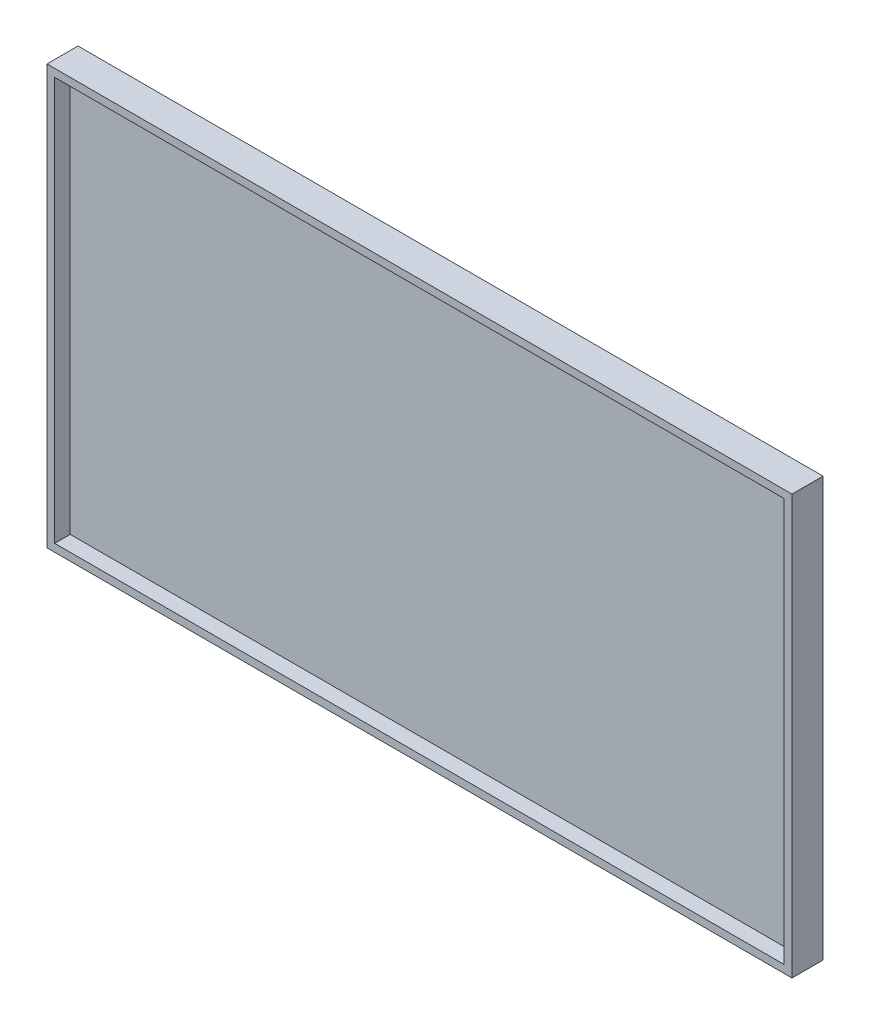
ISO-10303-21;
HEADER;
FILE_DESCRIPTION(('STEP AP214'),'2;1');
FILE_NAME('part.step','',(''),(''),'','','');
FILE_SCHEMA(('AUTOMOTIVE_DESIGN { 1 0 10303 214 1 1 1 1 }'));
ENDSEC;
DATA;
#1=APPLICATION_CONTEXT('core data for automotive mechanical design processes');
#2=APPLICATION_PROTOCOL_DEFINITION('international standard','automotive_design',2000,#1);
#3=PRODUCT_CONTEXT('',#1,'mechanical');
#4=PRODUCT('Part','Part','',(#3));
#5=PRODUCT_RELATED_PRODUCT_CATEGORY('part','',(#4));
#6=PRODUCT_DEFINITION_FORMATION('','',#4);
#7=PRODUCT_DEFINITION_CONTEXT('part definition',#1,'design');
#8=PRODUCT_DEFINITION('design','',#6,#7);
#9=PRODUCT_DEFINITION_SHAPE('','',#8);
#10=(LENGTH_UNIT() NAMED_UNIT(*) SI_UNIT(.MILLI.,.METRE.));
#11=(NAMED_UNIT(*) PLANE_ANGLE_UNIT() SI_UNIT($,.RADIAN.));
#12=(NAMED_UNIT(*) SI_UNIT($,.STERADIAN.) SOLID_ANGLE_UNIT());
#13=UNCERTAINTY_MEASURE_WITH_UNIT(LENGTH_MEASURE(1.E-05),#10,'distance_accuracy_value','');
#14=(GEOMETRIC_REPRESENTATION_CONTEXT(3) GLOBAL_UNCERTAINTY_ASSIGNED_CONTEXT((#13)) GLOBAL_UNIT_ASSIGNED_CONTEXT((#10,
#11,#12)) REPRESENTATION_CONTEXT('',''));
#15=CARTESIAN_POINT('',(0.,0.,0.));
#16=DIRECTION('',(0.,0.,1.));
#17=DIRECTION('',(1.,0.,0.));
#18=AXIS2_PLACEMENT_3D('',#15,#16,#17);
#19=CARTESIAN_POINT('',(42.75,61.5,-56.));
#20=DIRECTION('',(-1.,0.,0.));
#21=DIRECTION('',(0.,-1.,0.));
#22=AXIS2_PLACEMENT_3D('',#19,#20,#21);
#23=PLANE('',#22);
#24=DIRECTION('',(0.,1.,0.));
#25=VECTOR('',#24,1.);
#26=CARTESIAN_POINT('',(42.75,61.5,-58.));
#27=LINE('',#26,#25);
#28=CARTESIAN_POINT('',(42.75,34.5,-58.));
#29=VERTEX_POINT('',#28);
#30=CARTESIAN_POINT('',(42.75,61.5,-58.));
#31=VERTEX_POINT('',#30);
#32=EDGE_CURVE('E146',#29,#31,#27,.T.);
#33=ORIENTED_EDGE('',*,*,#32,.T.);
#34=DIRECTION('',(0.,0.,-1.));
#35=VECTOR('',#34,1.);
#36=CARTESIAN_POINT('',(42.75,61.5,-56.));
#37=LINE('',#36,#35);
#38=CARTESIAN_POINT('',(42.75,61.5,-56.));
#39=VERTEX_POINT('',#38);
#40=EDGE_CURVE('E11',#39,#31,#37,.T.);
#41=ORIENTED_EDGE('',*,*,#40,.F.);
#42=DIRECTION('',(0.,1.,0.));
#43=VECTOR('',#42,1.);
#44=CARTESIAN_POINT('',(42.75,61.5,-56.));
#45=LINE('',#44,#43);
#46=CARTESIAN_POINT('',(42.75,34.5,-56.));
#47=VERTEX_POINT('',#46);
#48=EDGE_CURVE('E150',#47,#39,#45,.T.);
#49=ORIENTED_EDGE('',*,*,#48,.F.);
#50=DIRECTION('',(0.,0.,-1.));
#51=VECTOR('',#50,1.);
#52=CARTESIAN_POINT('',(42.75,34.5,-56.));
#53=LINE('',#52,#51);
#54=EDGE_CURVE('E156',#47,#29,#53,.T.);
#55=ORIENTED_EDGE('',*,*,#54,.T.);
#56=EDGE_LOOP('',(#33,#41,#49,#55));
#57=FACE_BOUND('',#56,.T.);
#58=ADVANCED_FACE('F38',(#57),#23,.F.);
#59=CARTESIAN_POINT('',(42.75,61.5,-56.));
#60=DIRECTION('',(0.,-1.,0.));
#61=DIRECTION('',(1.,0.,0.));
#62=AXIS2_PLACEMENT_3D('',#59,#60,#61);
#63=PLANE('',#62);
#64=DIRECTION('',(-1.,0.,0.));
#65=VECTOR('',#64,1.);
#66=CARTESIAN_POINT('',(42.75,61.5,-58.));
#67=LINE('',#66,#65);
#68=CARTESIAN_POINT('',(-5.24999999999999,61.5,-58.));
#69=VERTEX_POINT('',#68);
#70=EDGE_CURVE('E159',#31,#69,#67,.T.);
#71=ORIENTED_EDGE('',*,*,#70,.T.);
#72=DIRECTION('',(0.,0.,-1.));
#73=VECTOR('',#72,1.);
#74=CARTESIAN_POINT('',(-5.24999999999999,61.5,-56.));
#75=LINE('',#74,#73);
#76=CARTESIAN_POINT('',(-5.24999999999999,61.5,-56.));
#77=VERTEX_POINT('',#76);
#78=EDGE_CURVE('E45',#77,#69,#75,.T.);
#79=ORIENTED_EDGE('',*,*,#78,.F.);
#80=DIRECTION('',(-1.,0.,0.));
#81=VECTOR('',#80,1.);
#82=CARTESIAN_POINT('',(42.75,61.5,-56.));
#83=LINE('',#82,#81);
#84=EDGE_CURVE('E89',#39,#77,#83,.T.);
#85=ORIENTED_EDGE('',*,*,#84,.F.);
#86=ORIENTED_EDGE('',*,*,#40,.T.);
#87=EDGE_LOOP('',(#71,#79,#85,#86));
#88=FACE_BOUND('',#87,.T.);
#89=ADVANCED_FACE('F188',(#88),#63,.F.);
#90=CARTESIAN_POINT('',(-5.24999999999999,61.5,-56.));
#91=DIRECTION('',(1.,0.,0.));
#92=DIRECTION('',(0.,1.,0.));
#93=AXIS2_PLACEMENT_3D('',#90,#91,#92);
#94=PLANE('',#93);
#95=DIRECTION('',(0.,-1.,0.));
#96=VECTOR('',#95,1.);
#97=CARTESIAN_POINT('',(-5.24999999999999,61.5,-58.));
#98=LINE('',#97,#96);
#99=CARTESIAN_POINT('',(-5.24999999999999,34.5,-58.));
#100=VERTEX_POINT('',#99);
#101=EDGE_CURVE('E161',#69,#100,#98,.T.);
#102=ORIENTED_EDGE('',*,*,#101,.T.);
#103=DIRECTION('',(0.,0.,-1.));
#104=VECTOR('',#103,1.);
#105=CARTESIAN_POINT('',(-5.24999999999999,34.5,-56.));
#106=LINE('',#105,#104);
#107=CARTESIAN_POINT('',(-5.24999999999999,34.5,-56.));
#108=VERTEX_POINT('',#107);
#109=EDGE_CURVE('E165',#108,#100,#106,.T.);
#110=ORIENTED_EDGE('',*,*,#109,.F.);
#111=DIRECTION('',(0.,-1.,0.));
#112=VECTOR('',#111,1.);
#113=CARTESIAN_POINT('',(-5.24999999999999,61.5,-56.));
#114=LINE('',#113,#112);
#115=EDGE_CURVE('E153',#77,#108,#114,.T.);
#116=ORIENTED_EDGE('',*,*,#115,.F.);
#117=ORIENTED_EDGE('',*,*,#78,.T.);
#118=EDGE_LOOP('',(#102,#110,#116,#117));
#119=FACE_BOUND('',#118,.T.);
#120=ADVANCED_FACE('F170',(#119),#94,.F.);
#121=CARTESIAN_POINT('',(42.75,34.5,-56.));
#122=DIRECTION('',(0.,1.,0.));
#123=DIRECTION('',(-1.,0.,0.));
#124=AXIS2_PLACEMENT_3D('',#121,#122,#123);
#125=PLANE('',#124);
#126=DIRECTION('',(1.,0.,0.));
#127=VECTOR('',#126,1.);
#128=CARTESIAN_POINT('',(42.75,34.5,-58.));
#129=LINE('',#128,#127);
#130=EDGE_CURVE('E82',#100,#29,#129,.T.);
#131=ORIENTED_EDGE('',*,*,#130,.T.);
#132=ORIENTED_EDGE('',*,*,#54,.F.);
#133=DIRECTION('',(1.,0.,0.));
#134=VECTOR('',#133,1.);
#135=CARTESIAN_POINT('',(42.75,34.5,-56.));
#136=LINE('',#135,#134);
#137=EDGE_CURVE('E61',#108,#47,#136,.T.);
#138=ORIENTED_EDGE('',*,*,#137,.F.);
#139=ORIENTED_EDGE('',*,*,#109,.T.);
#140=EDGE_LOOP('',(#131,#132,#138,#139));
#141=FACE_BOUND('',#140,.T.);
#142=ADVANCED_FACE('F178',(#141),#125,.F.);
#143=CARTESIAN_POINT('',(0.,0.,-56.));
#144=DIRECTION('',(0.,0.,-1.));
#145=DIRECTION('',(-1.,0.,0.));
#146=AXIS2_PLACEMENT_3D('',#143,#144,#145);
#147=PLANE('',#146);
#148=DIRECTION('',(-1.,0.,0.));
#149=VECTOR('',#148,1.);
#150=CARTESIAN_POINT('',(0.,61.,-56.));
#151=LINE('',#150,#149);
#152=CARTESIAN_POINT('',(42.25,61.,-56.));
#153=VERTEX_POINT('',#152);
#154=CARTESIAN_POINT('',(-4.74999999999999,61.,-56.));
#155=VERTEX_POINT('',#154);
#156=EDGE_CURVE('E140',#153,#155,#151,.T.);
#157=ORIENTED_EDGE('',*,*,#156,.F.);
#158=DIRECTION('',(0.,1.,0.));
#159=VECTOR('',#158,1.);
#160=CARTESIAN_POINT('',(42.25,0.,-56.));
#161=LINE('',#160,#159);
#162=CARTESIAN_POINT('',(42.25,35.,-56.));
#163=VERTEX_POINT('',#162);
#164=EDGE_CURVE('E52',#163,#153,#161,.T.);
#165=ORIENTED_EDGE('',*,*,#164,.F.);
#166=DIRECTION('',(1.,0.,0.));
#167=VECTOR('',#166,1.);
#168=CARTESIAN_POINT('',(0.,35.,-56.));
#169=LINE('',#168,#167);
#170=CARTESIAN_POINT('',(-4.74999999999999,35.,-56.));
#171=VERTEX_POINT('',#170);
#172=EDGE_CURVE('E131',#171,#163,#169,.T.);
#173=ORIENTED_EDGE('',*,*,#172,.F.);
#174=DIRECTION('',(0.,-1.,0.));
#175=VECTOR('',#174,1.);
#176=CARTESIAN_POINT('',(-4.74999999999999,0.,-56.));
#177=LINE('',#176,#175);
#178=EDGE_CURVE('E134',#155,#171,#177,.T.);
#179=ORIENTED_EDGE('',*,*,#178,.F.);
#180=EDGE_LOOP('',(#157,#165,#173,#179));
#181=FACE_BOUND('',#180,.T.);
#182=ORIENTED_EDGE('',*,*,#48,.T.);
#183=ORIENTED_EDGE('',*,*,#84,.T.);
#184=ORIENTED_EDGE('',*,*,#115,.T.);
#185=ORIENTED_EDGE('',*,*,#137,.T.);
#186=EDGE_LOOP('',(#182,#183,#184,#185));
#187=FACE_BOUND('',#186,.T.);
#188=ADVANCED_FACE('F180',(#181,#187),#147,.F.);
#189=CARTESIAN_POINT('',(0.,0.,-58.));
#190=DIRECTION('',(0.,0.,-1.));
#191=DIRECTION('',(-1.,0.,0.));
#192=AXIS2_PLACEMENT_3D('',#189,#190,#191);
#193=PLANE('',#192);
#194=ORIENTED_EDGE('',*,*,#32,.F.);
#195=ORIENTED_EDGE('',*,*,#130,.F.);
#196=ORIENTED_EDGE('',*,*,#101,.F.);
#197=ORIENTED_EDGE('',*,*,#70,.F.);
#198=EDGE_LOOP('',(#194,#195,#196,#197));
#199=FACE_BOUND('',#198,.T.);
#200=ADVANCED_FACE('F174',(#199),#193,.T.);
#201=CARTESIAN_POINT('',(42.25,0.,-57.));
#202=DIRECTION('',(1.,0.,0.));
#203=DIRECTION('',(0.,0.,-1.));
#204=AXIS2_PLACEMENT_3D('',#201,#202,#203);
#205=PLANE('',#204);
#206=ORIENTED_EDGE('',*,*,#164,.T.);
#207=DIRECTION('',(0.,0.,1.));
#208=VECTOR('',#207,1.);
#209=CARTESIAN_POINT('',(42.25,61.,-57.));
#210=LINE('',#209,#208);
#211=CARTESIAN_POINT('',(42.25,61.,-57.));
#212=VERTEX_POINT('',#211);
#213=EDGE_CURVE('E109',#212,#153,#210,.T.);
#214=ORIENTED_EDGE('',*,*,#213,.F.);
#215=DIRECTION('',(0.,1.,0.));
#216=VECTOR('',#215,1.);
#217=CARTESIAN_POINT('',(42.25,0.,-57.));
#218=LINE('',#217,#216);
#219=CARTESIAN_POINT('',(42.25,35.,-57.));
#220=VERTEX_POINT('',#219);
#221=EDGE_CURVE('E113',#220,#212,#218,.T.);
#222=ORIENTED_EDGE('',*,*,#221,.F.);
#223=DIRECTION('',(0.,0.,1.));
#224=VECTOR('',#223,1.);
#225=CARTESIAN_POINT('',(42.25,35.,-57.));
#226=LINE('',#225,#224);
#227=EDGE_CURVE('E144',#220,#163,#226,.T.);
#228=ORIENTED_EDGE('',*,*,#227,.T.);
#229=EDGE_LOOP('',(#206,#214,#222,#228));
#230=FACE_BOUND('',#229,.T.);
#231=ADVANCED_FACE('F111',(#230),#205,.F.);
#232=CARTESIAN_POINT('',(0.,35.,-57.));
#233=DIRECTION('',(0.,-1.,0.));
#234=DIRECTION('',(0.,0.,-1.));
#235=AXIS2_PLACEMENT_3D('',#232,#233,#234);
#236=PLANE('',#235);
#237=ORIENTED_EDGE('',*,*,#172,.T.);
#238=ORIENTED_EDGE('',*,*,#227,.F.);
#239=DIRECTION('',(1.,0.,0.));
#240=VECTOR('',#239,1.);
#241=CARTESIAN_POINT('',(0.,35.,-57.));
#242=LINE('',#241,#240);
#243=CARTESIAN_POINT('',(-4.74999999999999,35.,-57.));
#244=VERTEX_POINT('',#243);
#245=EDGE_CURVE('E119',#244,#220,#242,.T.);
#246=ORIENTED_EDGE('',*,*,#245,.F.);
#247=DIRECTION('',(0.,0.,1.));
#248=VECTOR('',#247,1.);
#249=CARTESIAN_POINT('',(-4.74999999999999,35.,-57.));
#250=LINE('',#249,#248);
#251=EDGE_CURVE('E147',#244,#171,#250,.T.);
#252=ORIENTED_EDGE('',*,*,#251,.T.);
#253=EDGE_LOOP('',(#237,#238,#246,#252));
#254=FACE_BOUND('',#253,.T.);
#255=ADVANCED_FACE('F234',(#254),#236,.F.);
#256=CARTESIAN_POINT('',(-4.74999999999999,0.,-57.));
#257=DIRECTION('',(-1.,0.,0.));
#258=DIRECTION('',(0.,0.,1.));
#259=AXIS2_PLACEMENT_3D('',#256,#257,#258);
#260=PLANE('',#259);
#261=ORIENTED_EDGE('',*,*,#178,.T.);
#262=ORIENTED_EDGE('',*,*,#251,.F.);
#263=DIRECTION('',(0.,-1.,0.));
#264=VECTOR('',#263,1.);
#265=CARTESIAN_POINT('',(-4.74999999999999,0.,-57.));
#266=LINE('',#265,#264);
#267=CARTESIAN_POINT('',(-4.74999999999999,61.,-57.));
#268=VERTEX_POINT('',#267);
#269=EDGE_CURVE('E127',#268,#244,#266,.T.);
#270=ORIENTED_EDGE('',*,*,#269,.F.);
#271=DIRECTION('',(0.,0.,1.));
#272=VECTOR('',#271,1.);
#273=CARTESIAN_POINT('',(-4.74999999999999,61.,-57.));
#274=LINE('',#273,#272);
#275=EDGE_CURVE('E118',#268,#155,#274,.T.);
#276=ORIENTED_EDGE('',*,*,#275,.T.);
#277=EDGE_LOOP('',(#261,#262,#270,#276));
#278=FACE_BOUND('',#277,.T.);
#279=ADVANCED_FACE('F244',(#278),#260,.F.);
#280=CARTESIAN_POINT('',(0.,61.,-57.));
#281=DIRECTION('',(0.,1.,0.));
#282=DIRECTION('',(0.,0.,1.));
#283=AXIS2_PLACEMENT_3D('',#280,#281,#282);
#284=PLANE('',#283);
#285=ORIENTED_EDGE('',*,*,#156,.T.);
#286=ORIENTED_EDGE('',*,*,#275,.F.);
#287=DIRECTION('',(-1.,0.,0.));
#288=VECTOR('',#287,1.);
#289=CARTESIAN_POINT('',(0.,61.,-57.));
#290=LINE('',#289,#288);
#291=EDGE_CURVE('E122',#212,#268,#290,.T.);
#292=ORIENTED_EDGE('',*,*,#291,.F.);
#293=ORIENTED_EDGE('',*,*,#213,.T.);
#294=EDGE_LOOP('',(#285,#286,#292,#293));
#295=FACE_BOUND('',#294,.T.);
#296=ADVANCED_FACE('F123',(#295),#284,.F.);
#297=CARTESIAN_POINT('',(0.,0.,-57.));
#298=DIRECTION('',(0.,0.,1.));
#299=DIRECTION('',(1.,0.,0.));
#300=AXIS2_PLACEMENT_3D('',#297,#298,#299);
#301=PLANE('',#300);
#302=ORIENTED_EDGE('',*,*,#221,.T.);
#303=ORIENTED_EDGE('',*,*,#291,.T.);
#304=ORIENTED_EDGE('',*,*,#269,.T.);
#305=ORIENTED_EDGE('',*,*,#245,.T.);
#306=EDGE_LOOP('',(#302,#303,#304,#305));
#307=FACE_BOUND('',#306,.T.);
#308=ADVANCED_FACE('F129',(#307),#301,.T.);
#309=CLOSED_SHELL('',(#58,#89,#120,#142,#188,#200,#231,#255,#279,#296,#308));
#310=MANIFOLD_SOLID_BREP('B2',#309);
#311=ADVANCED_BREP_SHAPE_REPRESENTATION('',(#18,#310),#14);
#312=SHAPE_DEFINITION_REPRESENTATION(#9,#311);
ENDSEC;
END-ISO-10303-21;
